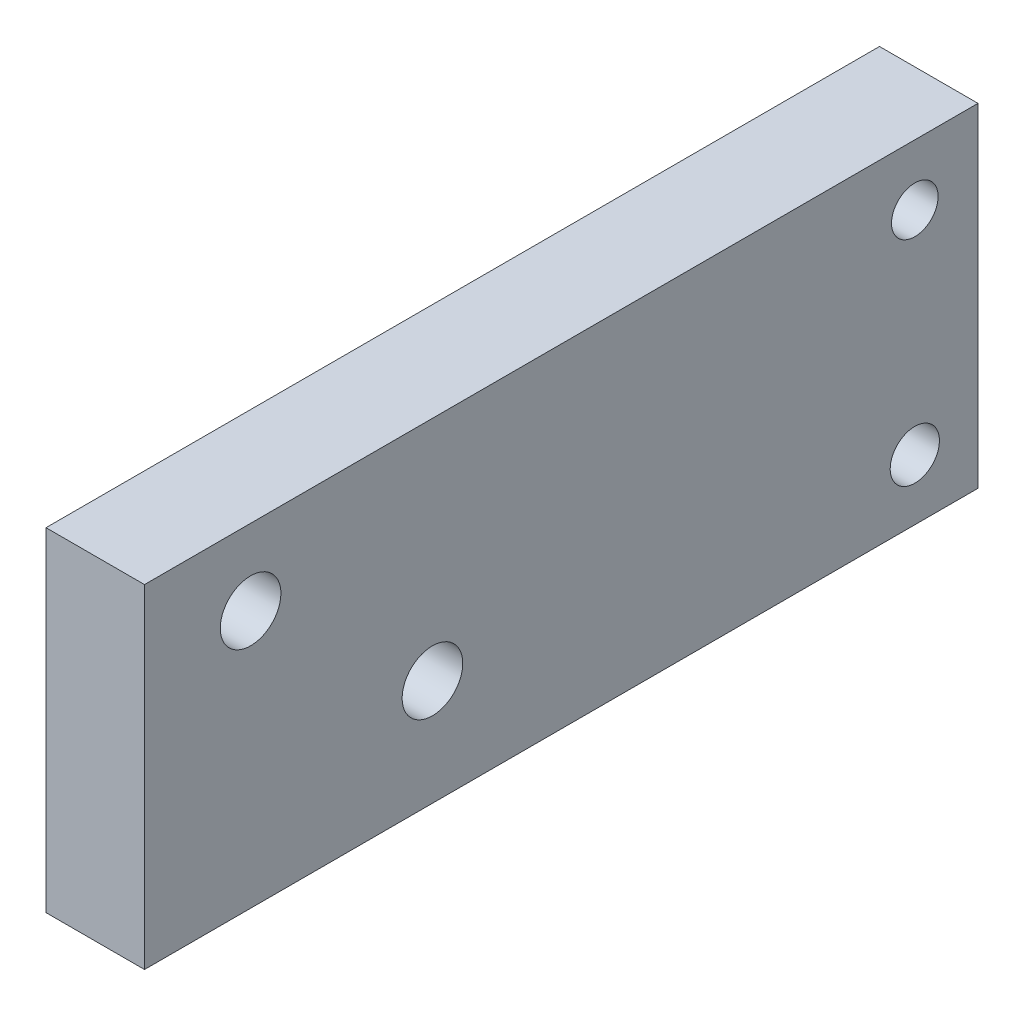
ISO-10303-21;
HEADER;
FILE_DESCRIPTION(('STEP AP214'),'2;1');
FILE_NAME('part.step','',(''),(''),'','','');
FILE_SCHEMA(('AUTOMOTIVE_DESIGN { 1 0 10303 214 1 1 1 1 }'));
ENDSEC;
DATA;
#1=APPLICATION_CONTEXT('core data for automotive mechanical design processes');
#2=APPLICATION_PROTOCOL_DEFINITION('international standard','automotive_design',2000,#1);
#3=PRODUCT_CONTEXT('',#1,'mechanical');
#4=PRODUCT('Part','Part','',(#3));
#5=PRODUCT_RELATED_PRODUCT_CATEGORY('part','',(#4));
#6=PRODUCT_DEFINITION_FORMATION('','',#4);
#7=PRODUCT_DEFINITION_CONTEXT('part definition',#1,'design');
#8=PRODUCT_DEFINITION('design','',#6,#7);
#9=PRODUCT_DEFINITION_SHAPE('','',#8);
#10=(LENGTH_UNIT() NAMED_UNIT(*) SI_UNIT(.MILLI.,.METRE.));
#11=(NAMED_UNIT(*) PLANE_ANGLE_UNIT() SI_UNIT($,.RADIAN.));
#12=(NAMED_UNIT(*) SI_UNIT($,.STERADIAN.) SOLID_ANGLE_UNIT());
#13=UNCERTAINTY_MEASURE_WITH_UNIT(LENGTH_MEASURE(1.E-05),#10,'distance_accuracy_value','');
#14=(GEOMETRIC_REPRESENTATION_CONTEXT(3) GLOBAL_UNCERTAINTY_ASSIGNED_CONTEXT((#13)) GLOBAL_UNIT_ASSIGNED_CONTEXT((#10,
#11,#12)) REPRESENTATION_CONTEXT('',''));
#15=CARTESIAN_POINT('',(0.,0.,0.));
#16=DIRECTION('',(0.,0.,1.));
#17=DIRECTION('',(1.,0.,0.));
#18=AXIS2_PLACEMENT_3D('',#15,#16,#17);
#19=CARTESIAN_POINT('',(4.,0.,20.));
#20=DIRECTION('',(1.,0.,0.));
#21=DIRECTION('',(0.,1.,0.));
#22=AXIS2_PLACEMENT_3D('',#19,#20,#21);
#23=PLANE('',#22);
#24=DIRECTION('',(0.,1.,0.));
#25=VECTOR('',#24,1.);
#26=CARTESIAN_POINT('',(4.,0.,23.65));
#27=LINE('',#26,#25);
#28=CARTESIAN_POINT('',(4.,-2.,23.65));
#29=VERTEX_POINT('',#28);
#30=CARTESIAN_POINT('',(4.,20.,23.65));
#31=VERTEX_POINT('',#30);
#32=EDGE_CURVE('E65',#29,#31,#27,.T.);
#33=ORIENTED_EDGE('',*,*,#32,.F.);
#34=DIRECTION('',(0.,0.,1.));
#35=VECTOR('',#34,1.);
#36=CARTESIAN_POINT('',(4.,-2.,-20.));
#37=LINE('',#36,#35);
#38=CARTESIAN_POINT('',(4.,-2.,-31.35));
#39=VERTEX_POINT('',#38);
#40=EDGE_CURVE('E11',#39,#29,#37,.T.);
#41=ORIENTED_EDGE('',*,*,#40,.F.);
#42=DIRECTION('',(0.,1.,0.));
#43=VECTOR('',#42,1.);
#44=CARTESIAN_POINT('',(4.,-2.,-31.35));
#45=LINE('',#44,#43);
#46=CARTESIAN_POINT('',(4.,20.,-31.35));
#47=VERTEX_POINT('',#46);
#48=EDGE_CURVE('E100',#39,#47,#45,.T.);
#49=ORIENTED_EDGE('',*,*,#48,.T.);
#50=DIRECTION('',(0.,0.,-1.));
#51=VECTOR('',#50,1.);
#52=CARTESIAN_POINT('',(4.,20.,-2.35));
#53=LINE('',#52,#51);
#54=EDGE_CURVE('E88',#31,#47,#53,.T.);
#55=ORIENTED_EDGE('',*,*,#54,.F.);
#56=EDGE_LOOP('',(#33,#41,#49,#55));
#57=FACE_BOUND('',#56,.T.);
#58=CARTESIAN_POINT('',(4.,15.,16.65));
#59=DIRECTION('',(1.,0.,0.));
#60=DIRECTION('',(0.,1.,0.));
#61=AXIS2_PLACEMENT_3D('',#58,#59,#60);
#62=CIRCLE('',#61,2.);
#63=CARTESIAN_POINT('',(4.,17.,16.65));
#64=VERTEX_POINT('',#63);
#65=EDGE_CURVE('E53',#64,#64,#62,.T.);
#66=ORIENTED_EDGE('',*,*,#65,.F.);
#67=EDGE_LOOP('',(#66));
#68=FACE_BOUND('',#67,.T.);
#69=CARTESIAN_POINT('',(4.,5.,4.65));
#70=DIRECTION('',(1.,0.,0.));
#71=DIRECTION('',(0.,1.,0.));
#72=AXIS2_PLACEMENT_3D('',#69,#70,#71);
#73=CIRCLE('',#72,2.);
#74=CARTESIAN_POINT('',(4.,7.,4.65));
#75=VERTEX_POINT('',#74);
#76=EDGE_CURVE('E151',#75,#75,#73,.T.);
#77=ORIENTED_EDGE('',*,*,#76,.F.);
#78=EDGE_LOOP('',(#77));
#79=FACE_BOUND('',#78,.T.);
#80=CARTESIAN_POINT('',(4.,2.,-27.18));
#81=DIRECTION('',(1.,0.,0.));
#82=DIRECTION('',(0.,1.,0.));
#83=AXIS2_PLACEMENT_3D('',#80,#81,#82);
#84=CIRCLE('',#83,1.62478867702751);
#85=CARTESIAN_POINT('',(4.,3.62478867702751,-27.18));
#86=VERTEX_POINT('',#85);
#87=EDGE_CURVE('E106',#86,#86,#84,.T.);
#88=ORIENTED_EDGE('',*,*,#87,.F.);
#89=EDGE_LOOP('',(#88));
#90=FACE_BOUND('',#89,.T.);
#91=CARTESIAN_POINT('',(4.,16.,-27.18));
#92=DIRECTION('',(1.,0.,0.));
#93=DIRECTION('',(0.,1.,0.));
#94=AXIS2_PLACEMENT_3D('',#91,#92,#93);
#95=CIRCLE('',#94,1.53712222643323);
#96=CARTESIAN_POINT('',(4.,17.5371222264332,-27.18));
#97=VERTEX_POINT('',#96);
#98=EDGE_CURVE('E121',#97,#97,#95,.T.);
#99=ORIENTED_EDGE('',*,*,#98,.F.);
#100=EDGE_LOOP('',(#99));
#101=FACE_BOUND('',#100,.T.);
#102=ADVANCED_FACE('F45',(#57,#68,#79,#90,#101),#23,.T.);
#103=CARTESIAN_POINT('',(0.,-2.,20.));
#104=DIRECTION('',(0.,1.,0.));
#105=DIRECTION('',(0.,0.,1.));
#106=AXIS2_PLACEMENT_3D('',#103,#104,#105);
#107=PLANE('',#106);
#108=ORIENTED_EDGE('',*,*,#40,.T.);
#109=DIRECTION('',(-1.,0.,0.));
#110=VECTOR('',#109,1.);
#111=CARTESIAN_POINT('',(20.,-2.,23.65));
#112=LINE('',#111,#110);
#113=CARTESIAN_POINT('',(-2.5,-2.,23.65));
#114=VERTEX_POINT('',#113);
#115=EDGE_CURVE('E82',#29,#114,#112,.T.);
#116=ORIENTED_EDGE('',*,*,#115,.T.);
#117=DIRECTION('',(0.,0.,-1.));
#118=VECTOR('',#117,1.);
#119=CARTESIAN_POINT('',(-2.5,-2.,-2.35));
#120=LINE('',#119,#118);
#121=CARTESIAN_POINT('',(-2.5,-2.,-31.35));
#122=VERTEX_POINT('',#121);
#123=EDGE_CURVE('E85',#114,#122,#120,.T.);
#124=ORIENTED_EDGE('',*,*,#123,.T.);
#125=DIRECTION('',(1.,0.,0.));
#126=VECTOR('',#125,1.);
#127=CARTESIAN_POINT('',(-2.5,-2.,-31.35));
#128=LINE('',#127,#126);
#129=EDGE_CURVE('E135',#122,#39,#128,.T.);
#130=ORIENTED_EDGE('',*,*,#129,.T.);
#131=EDGE_LOOP('',(#108,#116,#124,#130));
#132=FACE_BOUND('',#131,.T.);
#133=ADVANCED_FACE('F84',(#132),#107,.F.);
#134=CARTESIAN_POINT('',(20.,0.,23.65));
#135=DIRECTION('',(0.,0.,-1.));
#136=DIRECTION('',(0.,1.,0.));
#137=AXIS2_PLACEMENT_3D('',#134,#135,#136);
#138=PLANE('',#137);
#139=ORIENTED_EDGE('',*,*,#32,.T.);
#140=DIRECTION('',(1.,0.,0.));
#141=VECTOR('',#140,1.);
#142=CARTESIAN_POINT('',(0.,20.,23.65));
#143=LINE('',#142,#141);
#144=CARTESIAN_POINT('',(-2.5,20.,23.65));
#145=VERTEX_POINT('',#144);
#146=EDGE_CURVE('E103',#145,#31,#143,.T.);
#147=ORIENTED_EDGE('',*,*,#146,.F.);
#148=DIRECTION('',(0.,1.,0.));
#149=VECTOR('',#148,1.);
#150=CARTESIAN_POINT('',(-2.5,20.,23.65));
#151=LINE('',#150,#149);
#152=EDGE_CURVE('E96',#114,#145,#151,.T.);
#153=ORIENTED_EDGE('',*,*,#152,.F.);
#154=ORIENTED_EDGE('',*,*,#115,.F.);
#155=EDGE_LOOP('',(#139,#147,#153,#154));
#156=FACE_BOUND('',#155,.T.);
#157=ADVANCED_FACE('F102',(#156),#138,.F.);
#158=CARTESIAN_POINT('',(20.,5.,4.65));
#159=DIRECTION('',(-1.,0.,0.));
#160=DIRECTION('',(0.,0.,1.));
#161=AXIS2_PLACEMENT_3D('',#158,#159,#160);
#162=CYLINDRICAL_SURFACE('',#161,2.);
#163=ORIENTED_EDGE('',*,*,#76,.T.);
#164=EDGE_LOOP('',(#163));
#165=FACE_BOUND('',#164,.T.);
#166=CARTESIAN_POINT('',(-2.5,5.,4.65));
#167=DIRECTION('',(-1.,0.,0.));
#168=DIRECTION('',(0.,0.,1.));
#169=AXIS2_PLACEMENT_3D('',#166,#167,#168);
#170=CIRCLE('',#169,2.);
#171=CARTESIAN_POINT('',(-2.5,5.,6.65));
#172=VERTEX_POINT('',#171);
#173=EDGE_CURVE('E107',#172,#172,#170,.T.);
#174=ORIENTED_EDGE('',*,*,#173,.T.);
#175=EDGE_LOOP('',(#174));
#176=FACE_BOUND('',#175,.T.);
#177=ADVANCED_FACE('F195',(#165,#176),#162,.F.);
#178=CARTESIAN_POINT('',(20.,15.,16.65));
#179=DIRECTION('',(-1.,0.,0.));
#180=DIRECTION('',(0.,0.,1.));
#181=AXIS2_PLACEMENT_3D('',#178,#179,#180);
#182=CYLINDRICAL_SURFACE('',#181,2.);
#183=ORIENTED_EDGE('',*,*,#65,.T.);
#184=EDGE_LOOP('',(#183));
#185=FACE_BOUND('',#184,.T.);
#186=CARTESIAN_POINT('',(-2.5,15.,16.65));
#187=DIRECTION('',(-1.,0.,0.));
#188=DIRECTION('',(0.,0.,1.));
#189=AXIS2_PLACEMENT_3D('',#186,#187,#188);
#190=CIRCLE('',#189,2.);
#191=CARTESIAN_POINT('',(-2.5,15.,18.65));
#192=VERTEX_POINT('',#191);
#193=EDGE_CURVE('E115',#192,#192,#190,.T.);
#194=ORIENTED_EDGE('',*,*,#193,.T.);
#195=EDGE_LOOP('',(#194));
#196=FACE_BOUND('',#195,.T.);
#197=ADVANCED_FACE('F158',(#185,#196),#182,.F.);
#198=CARTESIAN_POINT('',(0.,20.,0.));
#199=DIRECTION('',(0.,1.,0.));
#200=DIRECTION('',(0.,0.,1.));
#201=AXIS2_PLACEMENT_3D('',#198,#199,#200);
#202=PLANE('',#201);
#203=DIRECTION('',(0.,0.,1.));
#204=VECTOR('',#203,1.);
#205=CARTESIAN_POINT('',(-2.5,20.,-2.35));
#206=LINE('',#205,#204);
#207=CARTESIAN_POINT('',(-2.5,20.,-31.35));
#208=VERTEX_POINT('',#207);
#209=EDGE_CURVE('E132',#208,#145,#206,.T.);
#210=ORIENTED_EDGE('',*,*,#209,.T.);
#211=ORIENTED_EDGE('',*,*,#146,.T.);
#212=ORIENTED_EDGE('',*,*,#54,.T.);
#213=DIRECTION('',(1.,0.,0.));
#214=VECTOR('',#213,1.);
#215=CARTESIAN_POINT('',(-2.5,20.,-31.35));
#216=LINE('',#215,#214);
#217=EDGE_CURVE('E139',#208,#47,#216,.T.);
#218=ORIENTED_EDGE('',*,*,#217,.F.);
#219=EDGE_LOOP('',(#210,#211,#212,#218));
#220=FACE_BOUND('',#219,.T.);
#221=ADVANCED_FACE('F188',(#220),#202,.T.);
#222=CARTESIAN_POINT('',(-2.5,-2.,-31.35));
#223=DIRECTION('',(0.,0.,-1.));
#224=DIRECTION('',(-1.,0.,0.));
#225=AXIS2_PLACEMENT_3D('',#222,#223,#224);
#226=PLANE('',#225);
#227=ORIENTED_EDGE('',*,*,#48,.F.);
#228=ORIENTED_EDGE('',*,*,#129,.F.);
#229=DIRECTION('',(0.,1.,0.));
#230=VECTOR('',#229,1.);
#231=CARTESIAN_POINT('',(-2.5,-2.,-31.35));
#232=LINE('',#231,#230);
#233=EDGE_CURVE('E98',#122,#208,#232,.T.);
#234=ORIENTED_EDGE('',*,*,#233,.T.);
#235=ORIENTED_EDGE('',*,*,#217,.T.);
#236=EDGE_LOOP('',(#227,#228,#234,#235));
#237=FACE_BOUND('',#236,.T.);
#238=ADVANCED_FACE('F181',(#237),#226,.T.);
#239=CARTESIAN_POINT('',(-2.5,0.,0.));
#240=DIRECTION('',(-1.,0.,0.));
#241=DIRECTION('',(0.,-1.,0.));
#242=AXIS2_PLACEMENT_3D('',#239,#240,#241);
#243=PLANE('',#242);
#244=CARTESIAN_POINT('',(-2.5,2.,-27.18));
#245=DIRECTION('',(1.,0.,0.));
#246=DIRECTION('',(0.,1.,0.));
#247=AXIS2_PLACEMENT_3D('',#244,#245,#246);
#248=CIRCLE('',#247,1.62478867702751);
#249=CARTESIAN_POINT('',(-2.5,3.6247886770275,-27.18));
#250=VERTEX_POINT('',#249);
#251=EDGE_CURVE('E112',#250,#250,#248,.T.);
#252=ORIENTED_EDGE('',*,*,#251,.T.);
#253=EDGE_LOOP('',(#252));
#254=FACE_BOUND('',#253,.T.);
#255=CARTESIAN_POINT('',(-2.5,16.,-27.18));
#256=DIRECTION('',(1.,0.,0.));
#257=DIRECTION('',(0.,1.,0.));
#258=AXIS2_PLACEMENT_3D('',#255,#256,#257);
#259=CIRCLE('',#258,1.53712222643323);
#260=CARTESIAN_POINT('',(-2.5,17.5371222264332,-27.18));
#261=VERTEX_POINT('',#260);
#262=EDGE_CURVE('E123',#261,#261,#259,.T.);
#263=ORIENTED_EDGE('',*,*,#262,.T.);
#264=EDGE_LOOP('',(#263));
#265=FACE_BOUND('',#264,.T.);
#266=ORIENTED_EDGE('',*,*,#123,.F.);
#267=ORIENTED_EDGE('',*,*,#152,.T.);
#268=ORIENTED_EDGE('',*,*,#209,.F.);
#269=ORIENTED_EDGE('',*,*,#233,.F.);
#270=EDGE_LOOP('',(#266,#267,#268,#269));
#271=FACE_BOUND('',#270,.T.);
#272=ORIENTED_EDGE('',*,*,#173,.F.);
#273=EDGE_LOOP('',(#272));
#274=FACE_BOUND('',#273,.T.);
#275=ORIENTED_EDGE('',*,*,#193,.F.);
#276=EDGE_LOOP('',(#275));
#277=FACE_BOUND('',#276,.T.);
#278=ADVANCED_FACE('F93',(#254,#265,#271,#274,#277),#243,.T.);
#279=CARTESIAN_POINT('',(-2.5,16.,-27.18));
#280=DIRECTION('',(1.,0.,0.));
#281=DIRECTION('',(0.,1.,0.));
#282=AXIS2_PLACEMENT_3D('',#279,#280,#281);
#283=CYLINDRICAL_SURFACE('',#282,1.53712222643323);
#284=CARTESIAN_POINT('',(-2.5,17.5371222264332,-27.18));
#285=CARTESIAN_POINT('',(-2.43229166666667,17.5371222264332,-27.18));
#286=CARTESIAN_POINT('',(-2.36458333333333,17.5371222264332,-27.18));
#287=CARTESIAN_POINT('',(-2.22916666666667,17.5371222264332,-27.18));
#288=CARTESIAN_POINT('',(-2.16145833333333,17.5371222264332,-27.18));
#289=CARTESIAN_POINT('',(-2.02604166666667,17.5371222264332,-27.18));
#290=CARTESIAN_POINT('',(-1.95833333333333,17.5371222264332,-27.18));
#291=CARTESIAN_POINT('',(-1.82291666666667,17.5371222264332,-27.18));
#292=CARTESIAN_POINT('',(-1.75520833333333,17.5371222264332,-27.18));
#293=CARTESIAN_POINT('',(-1.61979166666667,17.5371222264332,-27.18));
#294=CARTESIAN_POINT('',(-1.55208333333333,17.5371222264332,-27.18));
#295=CARTESIAN_POINT('',(-1.41666666666667,17.5371222264332,-27.18));
#296=CARTESIAN_POINT('',(-1.34895833333333,17.5371222264332,-27.18));
#297=CARTESIAN_POINT('',(-1.21354166666667,17.5371222264332,-27.18));
#298=CARTESIAN_POINT('',(-1.14583333333333,17.5371222264332,-27.18));
#299=CARTESIAN_POINT('',(-1.01041666666667,17.5371222264332,-27.18));
#300=CARTESIAN_POINT('',(-0.942708333333333,17.5371222264332,-27.18));
#301=CARTESIAN_POINT('',(-0.807291666666667,17.5371222264332,-27.18));
#302=CARTESIAN_POINT('',(-0.739583333333333,17.5371222264332,-27.18));
#303=CARTESIAN_POINT('',(-0.604166666666667,17.5371222264332,-27.18));
#304=CARTESIAN_POINT('',(-0.536458333333333,17.5371222264332,-27.18));
#305=CARTESIAN_POINT('',(-0.401041666666667,17.5371222264332,-27.18));
#306=CARTESIAN_POINT('',(-0.333333333333333,17.5371222264332,-27.18));
#307=CARTESIAN_POINT('',(-0.197916666666666,17.5371222264332,-27.18));
#308=CARTESIAN_POINT('',(-0.130208333333333,17.5371222264332,-27.18));
#309=CARTESIAN_POINT('',(0.00520833333333365,17.5371222264332,-27.18));
#310=CARTESIAN_POINT('',(0.0729166666666669,17.5371222264332,-27.18));
#311=CARTESIAN_POINT('',(0.208333333333334,17.5371222264332,-27.18));
#312=CARTESIAN_POINT('',(0.276041666666667,17.5371222264332,-27.18));
#313=CARTESIAN_POINT('',(0.411458333333334,17.5371222264332,-27.18));
#314=CARTESIAN_POINT('',(0.479166666666667,17.5371222264332,-27.18));
#315=CARTESIAN_POINT('',(0.614583333333333,17.5371222264332,-27.18));
#316=CARTESIAN_POINT('',(0.682291666666667,17.5371222264332,-27.18));
#317=CARTESIAN_POINT('',(0.817708333333334,17.5371222264332,-27.18));
#318=CARTESIAN_POINT('',(0.885416666666667,17.5371222264332,-27.18));
#319=CARTESIAN_POINT('',(1.02083333333333,17.5371222264332,-27.18));
#320=CARTESIAN_POINT('',(1.08854166666667,17.5371222264332,-27.18));
#321=CARTESIAN_POINT('',(1.22395833333333,17.5371222264332,-27.18));
#322=CARTESIAN_POINT('',(1.29166666666667,17.5371222264332,-27.18));
#323=CARTESIAN_POINT('',(1.42708333333333,17.5371222264332,-27.18));
#324=CARTESIAN_POINT('',(1.49479166666667,17.5371222264332,-27.18));
#325=CARTESIAN_POINT('',(1.63020833333333,17.5371222264332,-27.18));
#326=CARTESIAN_POINT('',(1.69791666666667,17.5371222264332,-27.18));
#327=CARTESIAN_POINT('',(1.83333333333333,17.5371222264332,-27.18));
#328=CARTESIAN_POINT('',(1.90104166666667,17.5371222264332,-27.18));
#329=CARTESIAN_POINT('',(2.03645833333333,17.5371222264332,-27.18));
#330=CARTESIAN_POINT('',(2.10416666666667,17.5371222264332,-27.18));
#331=CARTESIAN_POINT('',(2.23958333333333,17.5371222264332,-27.18));
#332=CARTESIAN_POINT('',(2.30729166666667,17.5371222264332,-27.18));
#333=CARTESIAN_POINT('',(2.44270833333333,17.5371222264332,-27.18));
#334=CARTESIAN_POINT('',(2.51041666666667,17.5371222264332,-27.18));
#335=CARTESIAN_POINT('',(2.64583333333333,17.5371222264332,-27.18));
#336=CARTESIAN_POINT('',(2.71354166666667,17.5371222264332,-27.18));
#337=CARTESIAN_POINT('',(2.84895833333333,17.5371222264332,-27.18));
#338=CARTESIAN_POINT('',(2.91666666666667,17.5371222264332,-27.18));
#339=CARTESIAN_POINT('',(3.05208333333333,17.5371222264332,-27.18));
#340=CARTESIAN_POINT('',(3.11979166666667,17.5371222264332,-27.18));
#341=CARTESIAN_POINT('',(3.25520833333333,17.5371222264332,-27.18));
#342=CARTESIAN_POINT('',(3.32291666666667,17.5371222264332,-27.18));
#343=CARTESIAN_POINT('',(3.45833333333333,17.5371222264332,-27.18));
#344=CARTESIAN_POINT('',(3.52604166666667,17.5371222264332,-27.18));
#345=CARTESIAN_POINT('',(3.66145833333333,17.5371222264332,-27.18));
#346=CARTESIAN_POINT('',(3.72916666666667,17.5371222264332,-27.18));
#347=CARTESIAN_POINT('',(3.86458333333333,17.5371222264332,-27.18));
#348=CARTESIAN_POINT('',(3.93229166666667,17.5371222264332,-27.18));
#349=CARTESIAN_POINT('',(4.,17.5371222264332,-27.18));
#350=B_SPLINE_CURVE_WITH_KNOTS('',3,(#284,#285,#286,#287,#288,#289,#290,#291,#292,#293,#294,
#295,#296,#297,#298,#299,#300,#301,#302,#303,#304,#305,#306,#307,#308,#309,#310,#311,#312,#313,
#314,#315,#316,#317,#318,#319,#320,#321,#322,#323,#324,#325,#326,#327,#328,#329,#330,#331,#332,
#333,#334,#335,#336,#337,#338,#339,#340,#341,#342,#343,#344,#345,#346,#347,#348,#349),
.UNSPECIFIED.,.F.,.F.,(4,2,2,2,2,2,2,2,2,2,2,2,2,2,2,2,2,2,2,2,2,2,2,2,2,2,2,2,2,2,2,2,4),(0.,
0.203125,0.40625,0.609375,0.8125,1.015625,1.21875,1.421875,1.625,1.828125,2.03125,2.234375,
2.4375,2.640625,2.84375,3.046875,3.25,3.453125,3.65625,3.859375,4.0625,4.265625,4.46875,
4.671875,4.875,5.078125,5.28125,5.484375,5.6875,5.890625,6.09375,6.296875,6.5),.UNSPECIFIED.);
#351=EDGE_CURVE('BSEAM170',#261,#97,#350,.T.);
#352=ORIENTED_EDGE('',*,*,#262,.F.);
#353=ORIENTED_EDGE('',*,*,#98,.T.);
#354=ORIENTED_EDGE('',*,*,#351,.T.);
#355=ORIENTED_EDGE('',*,*,#351,.F.);
#356=EDGE_LOOP('',(#352,#354,#353,#355));
#357=FACE_BOUND('',#356,.T.);
#358=ADVANCED_FACE('F170',(#357),#283,.F.);
#359=CARTESIAN_POINT('',(-2.5,2.,-27.18));
#360=DIRECTION('',(1.,0.,0.));
#361=DIRECTION('',(0.,1.,0.));
#362=AXIS2_PLACEMENT_3D('',#359,#360,#361);
#363=CYLINDRICAL_SURFACE('',#362,1.62478867702751);
#364=CARTESIAN_POINT('',(-2.5,3.6247886770275,-27.18));
#365=CARTESIAN_POINT('',(-2.43229166666666,3.6247886770275,-27.18));
#366=CARTESIAN_POINT('',(-2.36458333333333,3.6247886770275,-27.18));
#367=CARTESIAN_POINT('',(-2.22916666666666,3.6247886770275,-27.18));
#368=CARTESIAN_POINT('',(-2.16145833333333,3.6247886770275,-27.18));
#369=CARTESIAN_POINT('',(-2.02604166666666,3.6247886770275,-27.18));
#370=CARTESIAN_POINT('',(-1.95833333333333,3.6247886770275,-27.18));
#371=CARTESIAN_POINT('',(-1.82291666666666,3.6247886770275,-27.18));
#372=CARTESIAN_POINT('',(-1.75520833333333,3.6247886770275,-27.18));
#373=CARTESIAN_POINT('',(-1.61979166666666,3.6247886770275,-27.18));
#374=CARTESIAN_POINT('',(-1.55208333333333,3.6247886770275,-27.18));
#375=CARTESIAN_POINT('',(-1.41666666666666,3.6247886770275,-27.18));
#376=CARTESIAN_POINT('',(-1.34895833333333,3.6247886770275,-27.18));
#377=CARTESIAN_POINT('',(-1.21354166666666,3.6247886770275,-27.18));
#378=CARTESIAN_POINT('',(-1.14583333333333,3.6247886770275,-27.18));
#379=CARTESIAN_POINT('',(-1.01041666666666,3.6247886770275,-27.18));
#380=CARTESIAN_POINT('',(-0.942708333333331,3.6247886770275,-27.18));
#381=CARTESIAN_POINT('',(-0.807291666666664,3.6247886770275,-27.18));
#382=CARTESIAN_POINT('',(-0.739583333333331,3.6247886770275,-27.18));
#383=CARTESIAN_POINT('',(-0.604166666666664,3.6247886770275,-27.18));
#384=CARTESIAN_POINT('',(-0.536458333333331,3.6247886770275,-27.18));
#385=CARTESIAN_POINT('',(-0.401041666666664,3.6247886770275,-27.18));
#386=CARTESIAN_POINT('',(-0.333333333333331,3.6247886770275,-27.18));
#387=CARTESIAN_POINT('',(-0.197916666666664,3.6247886770275,-27.18));
#388=CARTESIAN_POINT('',(-0.13020833333333,3.6247886770275,-27.18));
#389=CARTESIAN_POINT('',(0.00520833333333626,3.6247886770275,-27.18));
#390=CARTESIAN_POINT('',(0.0729166666666695,3.6247886770275,-27.18));
#391=CARTESIAN_POINT('',(0.208333333333336,3.6247886770275,-27.18));
#392=CARTESIAN_POINT('',(0.27604166666667,3.6247886770275,-27.18));
#393=CARTESIAN_POINT('',(0.411458333333336,3.6247886770275,-27.18));
#394=CARTESIAN_POINT('',(0.479166666666669,3.6247886770275,-27.18));
#395=CARTESIAN_POINT('',(0.614583333333336,3.6247886770275,-27.18));
#396=CARTESIAN_POINT('',(0.68229166666667,3.6247886770275,-27.18));
#397=CARTESIAN_POINT('',(0.817708333333336,3.6247886770275,-27.18));
#398=CARTESIAN_POINT('',(0.88541666666667,3.6247886770275,-27.18));
#399=CARTESIAN_POINT('',(1.02083333333334,3.6247886770275,-27.18));
#400=CARTESIAN_POINT('',(1.08854166666667,3.6247886770275,-27.18));
#401=CARTESIAN_POINT('',(1.22395833333334,3.6247886770275,-27.18));
#402=CARTESIAN_POINT('',(1.29166666666667,3.6247886770275,-27.18));
#403=CARTESIAN_POINT('',(1.42708333333334,3.6247886770275,-27.18));
#404=CARTESIAN_POINT('',(1.49479166666667,3.6247886770275,-27.18));
#405=CARTESIAN_POINT('',(1.63020833333334,3.6247886770275,-27.18));
#406=CARTESIAN_POINT('',(1.69791666666667,3.6247886770275,-27.18));
#407=CARTESIAN_POINT('',(1.83333333333334,3.6247886770275,-27.18));
#408=CARTESIAN_POINT('',(1.90104166666667,3.6247886770275,-27.18));
#409=CARTESIAN_POINT('',(2.03645833333334,3.6247886770275,-27.18));
#410=CARTESIAN_POINT('',(2.10416666666667,3.6247886770275,-27.18));
#411=CARTESIAN_POINT('',(2.23958333333334,3.6247886770275,-27.18));
#412=CARTESIAN_POINT('',(2.30729166666667,3.6247886770275,-27.18));
#413=CARTESIAN_POINT('',(2.44270833333334,3.6247886770275,-27.18));
#414=CARTESIAN_POINT('',(2.51041666666667,3.6247886770275,-27.18));
#415=CARTESIAN_POINT('',(2.64583333333334,3.6247886770275,-27.18));
#416=CARTESIAN_POINT('',(2.71354166666667,3.6247886770275,-27.18));
#417=CARTESIAN_POINT('',(2.84895833333334,3.6247886770275,-27.18));
#418=CARTESIAN_POINT('',(2.91666666666667,3.6247886770275,-27.18));
#419=CARTESIAN_POINT('',(3.05208333333334,3.6247886770275,-27.18));
#420=CARTESIAN_POINT('',(3.11979166666667,3.6247886770275,-27.18));
#421=CARTESIAN_POINT('',(3.25520833333334,3.6247886770275,-27.18));
#422=CARTESIAN_POINT('',(3.32291666666667,3.62478867702751,-27.18));
#423=CARTESIAN_POINT('',(3.45833333333334,3.62478867702751,-27.18));
#424=CARTESIAN_POINT('',(3.52604166666667,3.62478867702751,-27.18));
#425=CARTESIAN_POINT('',(3.66145833333334,3.62478867702751,-27.18));
#426=CARTESIAN_POINT('',(3.72916666666667,3.62478867702751,-27.18));
#427=CARTESIAN_POINT('',(3.86458333333334,3.62478867702751,-27.18));
#428=CARTESIAN_POINT('',(3.93229166666667,3.62478867702751,-27.18));
#429=CARTESIAN_POINT('',(4.,3.62478867702751,-27.18));
#430=B_SPLINE_CURVE_WITH_KNOTS('',3,(#364,#365,#366,#367,#368,#369,#370,#371,#372,#373,#374,
#375,#376,#377,#378,#379,#380,#381,#382,#383,#384,#385,#386,#387,#388,#389,#390,#391,#392,#393,
#394,#395,#396,#397,#398,#399,#400,#401,#402,#403,#404,#405,#406,#407,#408,#409,#410,#411,#412,
#413,#414,#415,#416,#417,#418,#419,#420,#421,#422,#423,#424,#425,#426,#427,#428,#429),
.UNSPECIFIED.,.F.,.F.,(4,2,2,2,2,2,2,2,2,2,2,2,2,2,2,2,2,2,2,2,2,2,2,2,2,2,2,2,2,2,2,2,4),(0.,
0.203125,0.40625,0.609375,0.8125,1.015625,1.21875,1.421875,1.625,1.828125,2.03125,2.234375,
2.4375,2.640625,2.84375,3.046875,3.25,3.453125,3.65625,3.859375,4.0625,4.265625,4.46875,
4.671875,4.875,5.078125,5.28125,5.484375,5.6875,5.890625,6.09375,6.296875,6.5),.UNSPECIFIED.);
#431=EDGE_CURVE('BSEAM172',#250,#86,#430,.T.);
#432=ORIENTED_EDGE('',*,*,#251,.F.);
#433=ORIENTED_EDGE('',*,*,#87,.T.);
#434=ORIENTED_EDGE('',*,*,#431,.T.);
#435=ORIENTED_EDGE('',*,*,#431,.F.);
#436=EDGE_LOOP('',(#432,#434,#433,#435));
#437=FACE_BOUND('',#436,.T.);
#438=ADVANCED_FACE('F172',(#437),#363,.F.);
#439=CLOSED_SHELL('',(#102,#133,#157,#177,#197,#221,#238,#278,#358,#438));
#440=MANIFOLD_SOLID_BREP('B2',#439);
#441=ADVANCED_BREP_SHAPE_REPRESENTATION('',(#18,#440),#14);
#442=SHAPE_DEFINITION_REPRESENTATION(#9,#441);
ENDSEC;
END-ISO-10303-21;
